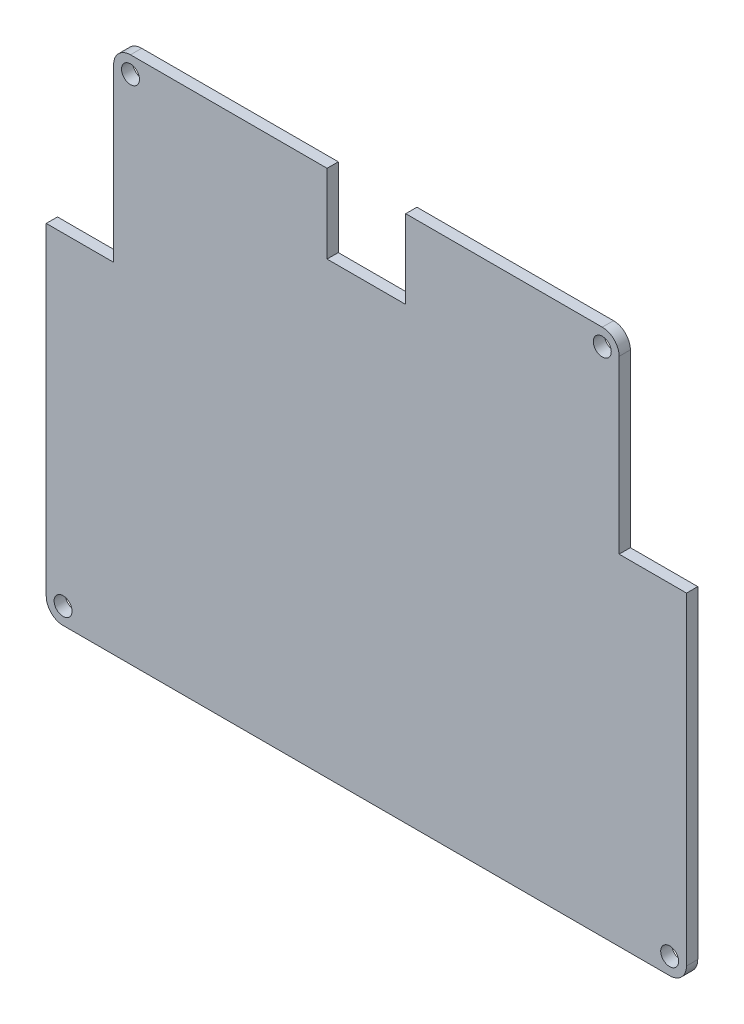
ISO-10303-21;
HEADER;
FILE_DESCRIPTION(('STEP AP214'),'2;1');
FILE_NAME('part.step','',(''),(''),'','','');
FILE_SCHEMA(('AUTOMOTIVE_DESIGN { 1 0 10303 214 1 1 1 1 }'));
ENDSEC;
DATA;
#1=APPLICATION_CONTEXT('core data for automotive mechanical design processes');
#2=APPLICATION_PROTOCOL_DEFINITION('international standard','automotive_design',2000,#1);
#3=PRODUCT_CONTEXT('',#1,'mechanical');
#4=PRODUCT('Part','Part','',(#3));
#5=PRODUCT_RELATED_PRODUCT_CATEGORY('part','',(#4));
#6=PRODUCT_DEFINITION_FORMATION('','',#4);
#7=PRODUCT_DEFINITION_CONTEXT('part definition',#1,'design');
#8=PRODUCT_DEFINITION('design','',#6,#7);
#9=PRODUCT_DEFINITION_SHAPE('','',#8);
#10=(LENGTH_UNIT() NAMED_UNIT(*) SI_UNIT(.MILLI.,.METRE.));
#11=(NAMED_UNIT(*) PLANE_ANGLE_UNIT() SI_UNIT($,.RADIAN.));
#12=(NAMED_UNIT(*) SI_UNIT($,.STERADIAN.) SOLID_ANGLE_UNIT());
#13=UNCERTAINTY_MEASURE_WITH_UNIT(LENGTH_MEASURE(1.E-05),#10,'distance_accuracy_value','');
#14=(GEOMETRIC_REPRESENTATION_CONTEXT(3) GLOBAL_UNCERTAINTY_ASSIGNED_CONTEXT((#13)) GLOBAL_UNIT_ASSIGNED_CONTEXT((#10,
#11,#12)) REPRESENTATION_CONTEXT('',''));
#15=CARTESIAN_POINT('',(0.,0.,0.));
#16=DIRECTION('',(0.,0.,1.));
#17=DIRECTION('',(1.,0.,0.));
#18=AXIS2_PLACEMENT_3D('',#15,#16,#17);
#19=CARTESIAN_POINT('',(54.,-29.1851675627543,2.));
#20=DIRECTION('',(0.,0.,-1.));
#21=DIRECTION('',(-1.,0.,0.));
#22=AXIS2_PLACEMENT_3D('',#19,#20,#21);
#23=PLANE('',#22);
#24=DIRECTION('',(0.,1.,0.));
#25=VECTOR('',#24,1.);
#26=CARTESIAN_POINT('',(57.,28.3148324372457,2.));
#27=LINE('',#26,#25);
#28=CARTESIAN_POINT('',(57.,-29.1851675627543,2.));
#29=VERTEX_POINT('',#28);
#30=CARTESIAN_POINT('',(57.,28.3148324372457,2.));
#31=VERTEX_POINT('',#30);
#32=EDGE_CURVE('E236',#29,#31,#27,.T.);
#33=ORIENTED_EDGE('',*,*,#32,.T.);
#34=DIRECTION('',(-1.,0.,0.));
#35=VECTOR('',#34,1.);
#36=CARTESIAN_POINT('',(57.,28.3148324372457,2.));
#37=LINE('',#36,#35);
#38=CARTESIAN_POINT('',(45.,28.3148324372457,2.));
#39=VERTEX_POINT('',#38);
#40=EDGE_CURVE('E124',#31,#39,#37,.T.);
#41=ORIENTED_EDGE('',*,*,#40,.T.);
#42=DIRECTION('',(0.,1.,0.));
#43=VECTOR('',#42,1.);
#44=CARTESIAN_POINT('',(45.,28.3148324372457,2.));
#45=LINE('',#44,#43);
#46=CARTESIAN_POINT('',(45.,58.8148324372457,2.));
#47=VERTEX_POINT('',#46);
#48=EDGE_CURVE('E289',#39,#47,#45,.T.);
#49=ORIENTED_EDGE('',*,*,#48,.T.);
#50=CARTESIAN_POINT('',(42.,58.8148324372457,2.));
#51=DIRECTION('',(0.,0.,1.));
#52=DIRECTION('',(1.,0.,0.));
#53=AXIS2_PLACEMENT_3D('',#50,#51,#52);
#54=CIRCLE('',#53,3.);
#55=CARTESIAN_POINT('',(42.,61.8148324372457,2.));
#56=VERTEX_POINT('',#55);
#57=EDGE_CURVE('E309',#47,#56,#54,.T.);
#58=ORIENTED_EDGE('',*,*,#57,.T.);
#59=DIRECTION('',(-1.,0.,0.));
#60=VECTOR('',#59,1.);
#61=CARTESIAN_POINT('',(7.,61.8148324372457,2.));
#62=LINE('',#61,#60);
#63=CARTESIAN_POINT('',(7.,61.8148324372457,2.));
#64=VERTEX_POINT('',#63);
#65=EDGE_CURVE('E305',#56,#64,#62,.T.);
#66=ORIENTED_EDGE('',*,*,#65,.T.);
#67=DIRECTION('',(0.,-1.,0.));
#68=VECTOR('',#67,1.);
#69=CARTESIAN_POINT('',(7.,61.8148324372457,2.));
#70=LINE('',#69,#68);
#71=CARTESIAN_POINT('',(7.,47.8148324372457,2.));
#72=VERTEX_POINT('',#71);
#73=EDGE_CURVE('E308',#64,#72,#70,.T.);
#74=ORIENTED_EDGE('',*,*,#73,.T.);
#75=DIRECTION('',(-1.,0.,0.));
#76=VECTOR('',#75,1.);
#77=CARTESIAN_POINT('',(-7.,47.8148324372457,2.));
#78=LINE('',#77,#76);
#79=CARTESIAN_POINT('',(-7.,47.8148324372457,2.));
#80=VERTEX_POINT('',#79);
#81=EDGE_CURVE('E313',#72,#80,#78,.T.);
#82=ORIENTED_EDGE('',*,*,#81,.T.);
#83=DIRECTION('',(0.,1.,0.));
#84=VECTOR('',#83,1.);
#85=CARTESIAN_POINT('',(-7.,61.8148324372457,2.));
#86=LINE('',#85,#84);
#87=CARTESIAN_POINT('',(-7.,61.8148324372457,2.));
#88=VERTEX_POINT('',#87);
#89=EDGE_CURVE('E320',#80,#88,#86,.T.);
#90=ORIENTED_EDGE('',*,*,#89,.T.);
#91=DIRECTION('',(-1.,0.,0.));
#92=VECTOR('',#91,1.);
#93=CARTESIAN_POINT('',(-42.,61.8148324372457,2.));
#94=LINE('',#93,#92);
#95=CARTESIAN_POINT('',(-42.,61.8148324372457,2.));
#96=VERTEX_POINT('',#95);
#97=EDGE_CURVE('E323',#88,#96,#94,.T.);
#98=ORIENTED_EDGE('',*,*,#97,.T.);
#99=CARTESIAN_POINT('',(-42.,58.8148324372457,2.));
#100=DIRECTION('',(0.,0.,1.));
#101=DIRECTION('',(-1.,0.,0.));
#102=AXIS2_PLACEMENT_3D('',#99,#100,#101);
#103=CIRCLE('',#102,3.);
#104=CARTESIAN_POINT('',(-45.,58.8148324372457,2.));
#105=VERTEX_POINT('',#104);
#106=EDGE_CURVE('E326',#96,#105,#103,.T.);
#107=ORIENTED_EDGE('',*,*,#106,.T.);
#108=DIRECTION('',(0.,-1.,0.));
#109=VECTOR('',#108,1.);
#110=CARTESIAN_POINT('',(-45.,28.3148324372457,2.));
#111=LINE('',#110,#109);
#112=CARTESIAN_POINT('',(-45.,28.3148324372457,2.));
#113=VERTEX_POINT('',#112);
#114=EDGE_CURVE('E329',#105,#113,#111,.T.);
#115=ORIENTED_EDGE('',*,*,#114,.T.);
#116=DIRECTION('',(-1.,0.,0.));
#117=VECTOR('',#116,1.);
#118=CARTESIAN_POINT('',(-45.,28.3148324372457,2.));
#119=LINE('',#118,#117);
#120=CARTESIAN_POINT('',(-57.,28.3148324372457,2.));
#121=VERTEX_POINT('',#120);
#122=EDGE_CURVE('E332',#113,#121,#119,.T.);
#123=ORIENTED_EDGE('',*,*,#122,.T.);
#124=DIRECTION('',(0.,-1.,0.));
#125=VECTOR('',#124,1.);
#126=CARTESIAN_POINT('',(-57.,28.3148324372457,2.));
#127=LINE('',#126,#125);
#128=CARTESIAN_POINT('',(-57.,-29.1851675627543,2.));
#129=VERTEX_POINT('',#128);
#130=EDGE_CURVE('E167',#121,#129,#127,.T.);
#131=ORIENTED_EDGE('',*,*,#130,.T.);
#132=CARTESIAN_POINT('',(-54.,-29.1851675627543,2.));
#133=DIRECTION('',(0.,0.,1.));
#134=DIRECTION('',(1.,0.,0.));
#135=AXIS2_PLACEMENT_3D('',#132,#133,#134);
#136=CIRCLE('',#135,3.);
#137=CARTESIAN_POINT('',(-54.,-32.1851675627543,2.));
#138=VERTEX_POINT('',#137);
#139=EDGE_CURVE('E161',#129,#138,#136,.T.);
#140=ORIENTED_EDGE('',*,*,#139,.T.);
#141=DIRECTION('',(1.,0.,0.));
#142=VECTOR('',#141,1.);
#143=CARTESIAN_POINT('',(54.,-32.1851675627543,2.));
#144=LINE('',#143,#142);
#145=CARTESIAN_POINT('',(54.,-32.1851675627543,2.));
#146=VERTEX_POINT('',#145);
#147=EDGE_CURVE('E165',#138,#146,#144,.T.);
#148=ORIENTED_EDGE('',*,*,#147,.T.);
#149=CARTESIAN_POINT('',(54.,-29.1851675627543,2.));
#150=DIRECTION('',(0.,0.,1.));
#151=DIRECTION('',(-1.,0.,0.));
#152=AXIS2_PLACEMENT_3D('',#149,#150,#151);
#153=CIRCLE('',#152,3.);
#154=EDGE_CURVE('E57',#146,#29,#153,.T.);
#155=ORIENTED_EDGE('',*,*,#154,.T.);
#156=EDGE_LOOP('',(#33,#41,#49,#58,#66,#74,#82,#90,#98,#107,#115,#123,#131,#140,#148,#155));
#157=FACE_BOUND('',#156,.T.);
#158=CARTESIAN_POINT('',(42.,58.8148324372457,2.));
#159=DIRECTION('',(0.,0.,1.));
#160=DIRECTION('',(1.,0.,0.));
#161=AXIS2_PLACEMENT_3D('',#158,#159,#160);
#162=CIRCLE('',#161,1.6);
#163=CARTESIAN_POINT('',(43.6,58.8148324372457,2.));
#164=VERTEX_POINT('',#163);
#165=EDGE_CURVE('E194',#164,#164,#162,.T.);
#166=ORIENTED_EDGE('',*,*,#165,.F.);
#167=EDGE_LOOP('',(#166));
#168=FACE_BOUND('',#167,.T.);
#169=CARTESIAN_POINT('',(54.,-29.1851675627543,2.));
#170=DIRECTION('',(0.,0.,1.));
#171=DIRECTION('',(1.,0.,0.));
#172=AXIS2_PLACEMENT_3D('',#169,#170,#171);
#173=CIRCLE('',#172,1.6);
#174=CARTESIAN_POINT('',(55.6,-29.1851675627543,2.));
#175=VERTEX_POINT('',#174);
#176=EDGE_CURVE('E402',#175,#175,#173,.T.);
#177=ORIENTED_EDGE('',*,*,#176,.F.);
#178=EDGE_LOOP('',(#177));
#179=FACE_BOUND('',#178,.T.);
#180=CARTESIAN_POINT('',(-54.,-29.1851675627543,2.));
#181=DIRECTION('',(0.,0.,1.));
#182=DIRECTION('',(-1.,0.,0.));
#183=AXIS2_PLACEMENT_3D('',#180,#181,#182);
#184=CIRCLE('',#183,1.6);
#185=CARTESIAN_POINT('',(-55.6,-29.1851675627543,2.));
#186=VERTEX_POINT('',#185);
#187=EDGE_CURVE('E394',#186,#186,#184,.T.);
#188=ORIENTED_EDGE('',*,*,#187,.F.);
#189=EDGE_LOOP('',(#188));
#190=FACE_BOUND('',#189,.T.);
#191=CARTESIAN_POINT('',(-42.,58.8148324372457,2.));
#192=DIRECTION('',(0.,0.,1.));
#193=DIRECTION('',(-1.,0.,0.));
#194=AXIS2_PLACEMENT_3D('',#191,#192,#193);
#195=CIRCLE('',#194,1.6);
#196=CARTESIAN_POINT('',(-43.6,58.8148324372457,2.));
#197=VERTEX_POINT('',#196);
#198=EDGE_CURVE('E383',#197,#197,#195,.T.);
#199=ORIENTED_EDGE('',*,*,#198,.F.);
#200=EDGE_LOOP('',(#199));
#201=FACE_BOUND('',#200,.T.);
#202=ADVANCED_FACE('F39',(#157,#168,#179,#190,#201),#23,.F.);
#203=CARTESIAN_POINT('',(54.,-29.1851675627543,0.));
#204=DIRECTION('',(0.,0.,-1.));
#205=DIRECTION('',(-1.,0.,0.));
#206=AXIS2_PLACEMENT_3D('',#203,#204,#205);
#207=PLANE('',#206);
#208=CARTESIAN_POINT('',(-54.,-29.1851675627543,0.));
#209=DIRECTION('',(0.,0.,1.));
#210=DIRECTION('',(-1.,0.,0.));
#211=AXIS2_PLACEMENT_3D('',#208,#209,#210);
#212=CIRCLE('',#211,1.6);
#213=CARTESIAN_POINT('',(-55.6,-29.1851675627543,0.));
#214=VERTEX_POINT('',#213);
#215=EDGE_CURVE('E391',#214,#214,#212,.T.);
#216=ORIENTED_EDGE('',*,*,#215,.T.);
#217=EDGE_LOOP('',(#216));
#218=FACE_BOUND('',#217,.T.);
#219=CARTESIAN_POINT('',(42.,58.8148324372457,0.));
#220=DIRECTION('',(0.,0.,1.));
#221=DIRECTION('',(1.,0.,0.));
#222=AXIS2_PLACEMENT_3D('',#219,#220,#221);
#223=CIRCLE('',#222,1.6);
#224=CARTESIAN_POINT('',(43.6,58.8148324372457,0.));
#225=VERTEX_POINT('',#224);
#226=EDGE_CURVE('E406',#225,#225,#223,.T.);
#227=ORIENTED_EDGE('',*,*,#226,.T.);
#228=EDGE_LOOP('',(#227));
#229=FACE_BOUND('',#228,.T.);
#230=DIRECTION('',(0.,1.,0.));
#231=VECTOR('',#230,1.);
#232=CARTESIAN_POINT('',(57.,28.3148324372457,0.));
#233=LINE('',#232,#231);
#234=CARTESIAN_POINT('',(57.,-29.1851675627543,0.));
#235=VERTEX_POINT('',#234);
#236=CARTESIAN_POINT('',(57.,28.3148324372457,0.));
#237=VERTEX_POINT('',#236);
#238=EDGE_CURVE('E189',#235,#237,#233,.T.);
#239=ORIENTED_EDGE('',*,*,#238,.F.);
#240=CARTESIAN_POINT('',(54.,-29.1851675627543,0.));
#241=DIRECTION('',(0.,0.,1.));
#242=DIRECTION('',(-1.,0.,0.));
#243=AXIS2_PLACEMENT_3D('',#240,#241,#242);
#244=CIRCLE('',#243,3.);
#245=CARTESIAN_POINT('',(54.,-32.1851675627543,0.));
#246=VERTEX_POINT('',#245);
#247=EDGE_CURVE('E116',#246,#235,#244,.T.);
#248=ORIENTED_EDGE('',*,*,#247,.F.);
#249=DIRECTION('',(1.,0.,0.));
#250=VECTOR('',#249,1.);
#251=CARTESIAN_POINT('',(54.,-32.1851675627543,0.));
#252=LINE('',#251,#250);
#253=CARTESIAN_POINT('',(-54.,-32.1851675627543,0.));
#254=VERTEX_POINT('',#253);
#255=EDGE_CURVE('E110',#254,#246,#252,.T.);
#256=ORIENTED_EDGE('',*,*,#255,.F.);
#257=CARTESIAN_POINT('',(-54.,-29.1851675627543,0.));
#258=DIRECTION('',(0.,0.,1.));
#259=DIRECTION('',(1.,0.,0.));
#260=AXIS2_PLACEMENT_3D('',#257,#258,#259);
#261=CIRCLE('',#260,3.);
#262=CARTESIAN_POINT('',(-57.,-29.1851675627543,0.));
#263=VERTEX_POINT('',#262);
#264=EDGE_CURVE('E176',#263,#254,#261,.T.);
#265=ORIENTED_EDGE('',*,*,#264,.F.);
#266=DIRECTION('',(0.,-1.,0.));
#267=VECTOR('',#266,1.);
#268=CARTESIAN_POINT('',(-57.,28.3148324372457,0.));
#269=LINE('',#268,#267);
#270=CARTESIAN_POINT('',(-57.,28.3148324372457,0.));
#271=VERTEX_POINT('',#270);
#272=EDGE_CURVE('E227',#271,#263,#269,.T.);
#273=ORIENTED_EDGE('',*,*,#272,.F.);
#274=DIRECTION('',(-1.,0.,0.));
#275=VECTOR('',#274,1.);
#276=CARTESIAN_POINT('',(-45.,28.3148324372457,0.));
#277=LINE('',#276,#275);
#278=CARTESIAN_POINT('',(-45.,28.3148324372457,0.));
#279=VERTEX_POINT('',#278);
#280=EDGE_CURVE('E224',#279,#271,#277,.T.);
#281=ORIENTED_EDGE('',*,*,#280,.F.);
#282=DIRECTION('',(0.,-1.,0.));
#283=VECTOR('',#282,1.);
#284=CARTESIAN_POINT('',(-45.,28.3148324372457,0.));
#285=LINE('',#284,#283);
#286=CARTESIAN_POINT('',(-45.,58.8148324372457,0.));
#287=VERTEX_POINT('',#286);
#288=EDGE_CURVE('E221',#287,#279,#285,.T.);
#289=ORIENTED_EDGE('',*,*,#288,.F.);
#290=CARTESIAN_POINT('',(-42.,58.8148324372457,0.));
#291=DIRECTION('',(0.,0.,1.));
#292=DIRECTION('',(-1.,0.,0.));
#293=AXIS2_PLACEMENT_3D('',#290,#291,#292);
#294=CIRCLE('',#293,3.);
#295=CARTESIAN_POINT('',(-42.,61.8148324372457,0.));
#296=VERTEX_POINT('',#295);
#297=EDGE_CURVE('E218',#296,#287,#294,.T.);
#298=ORIENTED_EDGE('',*,*,#297,.F.);
#299=DIRECTION('',(-1.,0.,0.));
#300=VECTOR('',#299,1.);
#301=CARTESIAN_POINT('',(-42.,61.8148324372457,0.));
#302=LINE('',#301,#300);
#303=CARTESIAN_POINT('',(-7.,61.8148324372457,0.));
#304=VERTEX_POINT('',#303);
#305=EDGE_CURVE('E215',#304,#296,#302,.T.);
#306=ORIENTED_EDGE('',*,*,#305,.F.);
#307=DIRECTION('',(0.,1.,0.));
#308=VECTOR('',#307,1.);
#309=CARTESIAN_POINT('',(-7.,61.8148324372457,0.));
#310=LINE('',#309,#308);
#311=CARTESIAN_POINT('',(-7.,47.8148324372457,0.));
#312=VERTEX_POINT('',#311);
#313=EDGE_CURVE('E212',#312,#304,#310,.T.);
#314=ORIENTED_EDGE('',*,*,#313,.F.);
#315=DIRECTION('',(-1.,0.,0.));
#316=VECTOR('',#315,1.);
#317=CARTESIAN_POINT('',(-7.,47.8148324372457,0.));
#318=LINE('',#317,#316);
#319=CARTESIAN_POINT('',(7.,47.8148324372457,0.));
#320=VERTEX_POINT('',#319);
#321=EDGE_CURVE('E209',#320,#312,#318,.T.);
#322=ORIENTED_EDGE('',*,*,#321,.F.);
#323=DIRECTION('',(0.,-1.,0.));
#324=VECTOR('',#323,1.);
#325=CARTESIAN_POINT('',(7.,61.8148324372457,0.));
#326=LINE('',#325,#324);
#327=CARTESIAN_POINT('',(7.,61.8148324372457,0.));
#328=VERTEX_POINT('',#327);
#329=EDGE_CURVE('E206',#328,#320,#326,.T.);
#330=ORIENTED_EDGE('',*,*,#329,.F.);
#331=DIRECTION('',(-1.,0.,0.));
#332=VECTOR('',#331,1.);
#333=CARTESIAN_POINT('',(7.,61.8148324372457,0.));
#334=LINE('',#333,#332);
#335=CARTESIAN_POINT('',(42.,61.8148324372457,0.));
#336=VERTEX_POINT('',#335);
#337=EDGE_CURVE('E203',#336,#328,#334,.T.);
#338=ORIENTED_EDGE('',*,*,#337,.F.);
#339=CARTESIAN_POINT('',(42.,58.8148324372457,0.));
#340=DIRECTION('',(0.,0.,1.));
#341=DIRECTION('',(1.,0.,0.));
#342=AXIS2_PLACEMENT_3D('',#339,#340,#341);
#343=CIRCLE('',#342,3.);
#344=CARTESIAN_POINT('',(45.,58.8148324372457,0.));
#345=VERTEX_POINT('',#344);
#346=EDGE_CURVE('E200',#345,#336,#343,.T.);
#347=ORIENTED_EDGE('',*,*,#346,.F.);
#348=DIRECTION('',(0.,1.,0.));
#349=VECTOR('',#348,1.);
#350=CARTESIAN_POINT('',(45.,28.3148324372457,0.));
#351=LINE('',#350,#349);
#352=CARTESIAN_POINT('',(45.,28.3148324372457,0.));
#353=VERTEX_POINT('',#352);
#354=EDGE_CURVE('E197',#353,#345,#351,.T.);
#355=ORIENTED_EDGE('',*,*,#354,.F.);
#356=DIRECTION('',(-1.,0.,0.));
#357=VECTOR('',#356,1.);
#358=CARTESIAN_POINT('',(57.,28.3148324372457,0.));
#359=LINE('',#358,#357);
#360=EDGE_CURVE('E193',#237,#353,#359,.T.);
#361=ORIENTED_EDGE('',*,*,#360,.F.);
#362=EDGE_LOOP('',(#239,#248,#256,#265,#273,#281,#289,#298,#306,#314,#322,#330,#338,#347,#355,#361));
#363=FACE_BOUND('',#362,.T.);
#364=CARTESIAN_POINT('',(54.,-29.1851675627543,0.));
#365=DIRECTION('',(0.,0.,1.));
#366=DIRECTION('',(1.,0.,0.));
#367=AXIS2_PLACEMENT_3D('',#364,#365,#366);
#368=CIRCLE('',#367,1.6);
#369=CARTESIAN_POINT('',(55.6,-29.1851675627543,0.));
#370=VERTEX_POINT('',#369);
#371=EDGE_CURVE('E398',#370,#370,#368,.T.);
#372=ORIENTED_EDGE('',*,*,#371,.T.);
#373=EDGE_LOOP('',(#372));
#374=FACE_BOUND('',#373,.T.);
#375=CARTESIAN_POINT('',(-42.,58.8148324372457,0.));
#376=DIRECTION('',(0.,0.,1.));
#377=DIRECTION('',(-1.,0.,0.));
#378=AXIS2_PLACEMENT_3D('',#375,#376,#377);
#379=CIRCLE('',#378,1.6);
#380=CARTESIAN_POINT('',(-43.6,58.8148324372457,0.));
#381=VERTEX_POINT('',#380);
#382=EDGE_CURVE('E386',#381,#381,#379,.T.);
#383=ORIENTED_EDGE('',*,*,#382,.T.);
#384=EDGE_LOOP('',(#383));
#385=FACE_BOUND('',#384,.T.);
#386=ADVANCED_FACE('F293',(#218,#229,#363,#374,#385),#207,.T.);
#387=CARTESIAN_POINT('',(57.,28.3148324372457,2.));
#388=DIRECTION('',(-1.,0.,0.));
#389=DIRECTION('',(0.,0.,1.));
#390=AXIS2_PLACEMENT_3D('',#387,#388,#389);
#391=PLANE('',#390);
#392=ORIENTED_EDGE('',*,*,#238,.T.);
#393=DIRECTION('',(0.,0.,-1.));
#394=VECTOR('',#393,1.);
#395=CARTESIAN_POINT('',(57.,28.3148324372457,2.));
#396=LINE('',#395,#394);
#397=EDGE_CURVE('E11',#31,#237,#396,.T.);
#398=ORIENTED_EDGE('',*,*,#397,.F.);
#399=ORIENTED_EDGE('',*,*,#32,.F.);
#400=DIRECTION('',(0.,0.,-1.));
#401=VECTOR('',#400,1.);
#402=CARTESIAN_POINT('',(57.,-29.1851675627543,2.));
#403=LINE('',#402,#401);
#404=EDGE_CURVE('E185',#29,#235,#403,.T.);
#405=ORIENTED_EDGE('',*,*,#404,.T.);
#406=EDGE_LOOP('',(#392,#398,#399,#405));
#407=FACE_BOUND('',#406,.T.);
#408=ADVANCED_FACE('F41',(#407),#391,.F.);
#409=CARTESIAN_POINT('',(57.,28.3148324372457,2.));
#410=DIRECTION('',(0.,-1.,0.));
#411=DIRECTION('',(0.,0.,-1.));
#412=AXIS2_PLACEMENT_3D('',#409,#410,#411);
#413=PLANE('',#412);
#414=ORIENTED_EDGE('',*,*,#360,.T.);
#415=DIRECTION('',(0.,0.,-1.));
#416=VECTOR('',#415,1.);
#417=CARTESIAN_POINT('',(45.,28.3148324372457,2.));
#418=LINE('',#417,#416);
#419=EDGE_CURVE('E49',#39,#353,#418,.T.);
#420=ORIENTED_EDGE('',*,*,#419,.F.);
#421=ORIENTED_EDGE('',*,*,#40,.F.);
#422=ORIENTED_EDGE('',*,*,#397,.T.);
#423=EDGE_LOOP('',(#414,#420,#421,#422));
#424=FACE_BOUND('',#423,.T.);
#425=ADVANCED_FACE('F564',(#424),#413,.F.);
#426=CARTESIAN_POINT('',(45.,28.3148324372457,2.));
#427=DIRECTION('',(-1.,0.,0.));
#428=DIRECTION('',(0.,0.,1.));
#429=AXIS2_PLACEMENT_3D('',#426,#427,#428);
#430=PLANE('',#429);
#431=ORIENTED_EDGE('',*,*,#354,.T.);
#432=DIRECTION('',(0.,0.,-1.));
#433=VECTOR('',#432,1.);
#434=CARTESIAN_POINT('',(45.,58.8148324372457,2.));
#435=LINE('',#434,#433);
#436=EDGE_CURVE('E279',#47,#345,#435,.T.);
#437=ORIENTED_EDGE('',*,*,#436,.F.);
#438=ORIENTED_EDGE('',*,*,#48,.F.);
#439=ORIENTED_EDGE('',*,*,#419,.T.);
#440=EDGE_LOOP('',(#431,#437,#438,#439));
#441=FACE_BOUND('',#440,.T.);
#442=ADVANCED_FACE('F287',(#441),#430,.F.);
#443=CARTESIAN_POINT('',(42.,58.8148324372457,2.));
#444=DIRECTION('',(0.,0.,-1.));
#445=DIRECTION('',(-1.,0.,0.));
#446=AXIS2_PLACEMENT_3D('',#443,#444,#445);
#447=CYLINDRICAL_SURFACE('',#446,3.);
#448=ORIENTED_EDGE('',*,*,#346,.T.);
#449=DIRECTION('',(0.,0.,-1.));
#450=VECTOR('',#449,1.);
#451=CARTESIAN_POINT('',(42.,61.8148324372457,2.));
#452=LINE('',#451,#450);
#453=EDGE_CURVE('E275',#56,#336,#452,.T.);
#454=ORIENTED_EDGE('',*,*,#453,.F.);
#455=ORIENTED_EDGE('',*,*,#57,.F.);
#456=ORIENTED_EDGE('',*,*,#436,.T.);
#457=EDGE_LOOP('',(#448,#454,#455,#456));
#458=FACE_BOUND('',#457,.T.);
#459=ADVANCED_FACE('F299',(#458),#447,.T.);
#460=CARTESIAN_POINT('',(7.,61.8148324372457,2.));
#461=DIRECTION('',(0.,-1.,0.));
#462=DIRECTION('',(1.,0.,0.));
#463=AXIS2_PLACEMENT_3D('',#460,#461,#462);
#464=PLANE('',#463);
#465=ORIENTED_EDGE('',*,*,#337,.T.);
#466=DIRECTION('',(0.,0.,-1.));
#467=VECTOR('',#466,1.);
#468=CARTESIAN_POINT('',(7.,61.8148324372457,2.));
#469=LINE('',#468,#467);
#470=EDGE_CURVE('E271',#64,#328,#469,.T.);
#471=ORIENTED_EDGE('',*,*,#470,.F.);
#472=ORIENTED_EDGE('',*,*,#65,.F.);
#473=ORIENTED_EDGE('',*,*,#453,.T.);
#474=EDGE_LOOP('',(#465,#471,#472,#473));
#475=FACE_BOUND('',#474,.T.);
#476=ADVANCED_FACE('F303',(#475),#464,.F.);
#477=CARTESIAN_POINT('',(7.,61.8148324372457,2.));
#478=DIRECTION('',(1.,0.,0.));
#479=DIRECTION('',(0.,0.,-1.));
#480=AXIS2_PLACEMENT_3D('',#477,#478,#479);
#481=PLANE('',#480);
#482=ORIENTED_EDGE('',*,*,#329,.T.);
#483=DIRECTION('',(0.,0.,-1.));
#484=VECTOR('',#483,1.);
#485=CARTESIAN_POINT('',(7.,47.8148324372457,2.));
#486=LINE('',#485,#484);
#487=EDGE_CURVE('E267',#72,#320,#486,.T.);
#488=ORIENTED_EDGE('',*,*,#487,.F.);
#489=ORIENTED_EDGE('',*,*,#73,.F.);
#490=ORIENTED_EDGE('',*,*,#470,.T.);
#491=EDGE_LOOP('',(#482,#488,#489,#490));
#492=FACE_BOUND('',#491,.T.);
#493=ADVANCED_FACE('F529',(#492),#481,.F.);
#494=CARTESIAN_POINT('',(-7.,47.8148324372457,2.));
#495=DIRECTION('',(0.,-1.,0.));
#496=DIRECTION('',(0.,0.,-1.));
#497=AXIS2_PLACEMENT_3D('',#494,#495,#496);
#498=PLANE('',#497);
#499=ORIENTED_EDGE('',*,*,#321,.T.);
#500=DIRECTION('',(0.,0.,-1.));
#501=VECTOR('',#500,1.);
#502=CARTESIAN_POINT('',(-7.,47.8148324372457,2.));
#503=LINE('',#502,#501);
#504=EDGE_CURVE('E263',#80,#312,#503,.T.);
#505=ORIENTED_EDGE('',*,*,#504,.F.);
#506=ORIENTED_EDGE('',*,*,#81,.F.);
#507=ORIENTED_EDGE('',*,*,#487,.T.);
#508=EDGE_LOOP('',(#499,#505,#506,#507));
#509=FACE_BOUND('',#508,.T.);
#510=ADVANCED_FACE('F519',(#509),#498,.F.);
#511=CARTESIAN_POINT('',(-7.,61.8148324372457,2.));
#512=DIRECTION('',(-1.,0.,0.));
#513=DIRECTION('',(0.,-1.,0.));
#514=AXIS2_PLACEMENT_3D('',#511,#512,#513);
#515=PLANE('',#514);
#516=ORIENTED_EDGE('',*,*,#313,.T.);
#517=DIRECTION('',(0.,0.,-1.));
#518=VECTOR('',#517,1.);
#519=CARTESIAN_POINT('',(-7.,61.8148324372457,2.));
#520=LINE('',#519,#518);
#521=EDGE_CURVE('E259',#88,#304,#520,.T.);
#522=ORIENTED_EDGE('',*,*,#521,.F.);
#523=ORIENTED_EDGE('',*,*,#89,.F.);
#524=ORIENTED_EDGE('',*,*,#504,.T.);
#525=EDGE_LOOP('',(#516,#522,#523,#524));
#526=FACE_BOUND('',#525,.T.);
#527=ADVANCED_FACE('F509',(#526),#515,.F.);
#528=CARTESIAN_POINT('',(-42.,61.8148324372457,2.));
#529=DIRECTION('',(0.,-1.,0.));
#530=DIRECTION('',(0.,0.,-1.));
#531=AXIS2_PLACEMENT_3D('',#528,#529,#530);
#532=PLANE('',#531);
#533=ORIENTED_EDGE('',*,*,#305,.T.);
#534=DIRECTION('',(0.,0.,-1.));
#535=VECTOR('',#534,1.);
#536=CARTESIAN_POINT('',(-42.,61.8148324372457,2.));
#537=LINE('',#536,#535);
#538=EDGE_CURVE('E255',#96,#296,#537,.T.);
#539=ORIENTED_EDGE('',*,*,#538,.F.);
#540=ORIENTED_EDGE('',*,*,#97,.F.);
#541=ORIENTED_EDGE('',*,*,#521,.T.);
#542=EDGE_LOOP('',(#533,#539,#540,#541));
#543=FACE_BOUND('',#542,.T.);
#544=ADVANCED_FACE('F499',(#543),#532,.F.);
#545=CARTESIAN_POINT('',(-42.,58.8148324372457,2.));
#546=DIRECTION('',(0.,0.,-1.));
#547=DIRECTION('',(-1.,0.,0.));
#548=AXIS2_PLACEMENT_3D('',#545,#546,#547);
#549=CYLINDRICAL_SURFACE('',#548,3.);
#550=ORIENTED_EDGE('',*,*,#297,.T.);
#551=DIRECTION('',(0.,0.,-1.));
#552=VECTOR('',#551,1.);
#553=CARTESIAN_POINT('',(-45.,58.8148324372457,2.));
#554=LINE('',#553,#552);
#555=EDGE_CURVE('E251',#105,#287,#554,.T.);
#556=ORIENTED_EDGE('',*,*,#555,.F.);
#557=ORIENTED_EDGE('',*,*,#106,.F.);
#558=ORIENTED_EDGE('',*,*,#538,.T.);
#559=EDGE_LOOP('',(#550,#556,#557,#558));
#560=FACE_BOUND('',#559,.T.);
#561=ADVANCED_FACE('F489',(#560),#549,.T.);
#562=CARTESIAN_POINT('',(-45.,28.3148324372457,2.));
#563=DIRECTION('',(1.,0.,0.));
#564=DIRECTION('',(0.,0.,-1.));
#565=AXIS2_PLACEMENT_3D('',#562,#563,#564);
#566=PLANE('',#565);
#567=ORIENTED_EDGE('',*,*,#288,.T.);
#568=DIRECTION('',(0.,0.,-1.));
#569=VECTOR('',#568,1.);
#570=CARTESIAN_POINT('',(-45.,28.3148324372457,2.));
#571=LINE('',#570,#569);
#572=EDGE_CURVE('E247',#113,#279,#571,.T.);
#573=ORIENTED_EDGE('',*,*,#572,.F.);
#574=ORIENTED_EDGE('',*,*,#114,.F.);
#575=ORIENTED_EDGE('',*,*,#555,.T.);
#576=EDGE_LOOP('',(#567,#573,#574,#575));
#577=FACE_BOUND('',#576,.T.);
#578=ADVANCED_FACE('F480',(#577),#566,.F.);
#579=CARTESIAN_POINT('',(-45.,28.3148324372457,2.));
#580=DIRECTION('',(0.,-1.,0.));
#581=DIRECTION('',(0.,0.,-1.));
#582=AXIS2_PLACEMENT_3D('',#579,#580,#581);
#583=PLANE('',#582);
#584=ORIENTED_EDGE('',*,*,#280,.T.);
#585=DIRECTION('',(0.,0.,-1.));
#586=VECTOR('',#585,1.);
#587=CARTESIAN_POINT('',(-57.,28.3148324372457,2.));
#588=LINE('',#587,#586);
#589=EDGE_CURVE('E243',#121,#271,#588,.T.);
#590=ORIENTED_EDGE('',*,*,#589,.F.);
#591=ORIENTED_EDGE('',*,*,#122,.F.);
#592=ORIENTED_EDGE('',*,*,#572,.T.);
#593=EDGE_LOOP('',(#584,#590,#591,#592));
#594=FACE_BOUND('',#593,.T.);
#595=ADVANCED_FACE('F340',(#594),#583,.F.);
#596=CARTESIAN_POINT('',(-57.,28.3148324372457,2.));
#597=DIRECTION('',(1.,0.,0.));
#598=DIRECTION('',(0.,0.,-1.));
#599=AXIS2_PLACEMENT_3D('',#596,#597,#598);
#600=PLANE('',#599);
#601=ORIENTED_EDGE('',*,*,#272,.T.);
#602=DIRECTION('',(0.,0.,-1.));
#603=VECTOR('',#602,1.);
#604=CARTESIAN_POINT('',(-57.,-29.1851675627543,2.));
#605=LINE('',#604,#603);
#606=EDGE_CURVE('E178',#129,#263,#605,.T.);
#607=ORIENTED_EDGE('',*,*,#606,.F.);
#608=ORIENTED_EDGE('',*,*,#130,.F.);
#609=ORIENTED_EDGE('',*,*,#589,.T.);
#610=EDGE_LOOP('',(#601,#607,#608,#609));
#611=FACE_BOUND('',#610,.T.);
#612=ADVANCED_FACE('F344',(#611),#600,.F.);
#613=CARTESIAN_POINT('',(-54.,-29.1851675627543,2.));
#614=DIRECTION('',(0.,0.,-1.));
#615=DIRECTION('',(-1.,0.,0.));
#616=AXIS2_PLACEMENT_3D('',#613,#614,#615);
#617=CYLINDRICAL_SURFACE('',#616,3.);
#618=ORIENTED_EDGE('',*,*,#264,.T.);
#619=DIRECTION('',(0.,0.,-1.));
#620=VECTOR('',#619,1.);
#621=CARTESIAN_POINT('',(-54.,-32.1851675627543,2.));
#622=LINE('',#621,#620);
#623=EDGE_CURVE('E173',#138,#254,#622,.T.);
#624=ORIENTED_EDGE('',*,*,#623,.F.);
#625=ORIENTED_EDGE('',*,*,#139,.F.);
#626=ORIENTED_EDGE('',*,*,#606,.T.);
#627=EDGE_LOOP('',(#618,#624,#625,#626));
#628=FACE_BOUND('',#627,.T.);
#629=ADVANCED_FACE('F174',(#628),#617,.T.);
#630=CARTESIAN_POINT('',(54.,-32.1851675627543,2.));
#631=DIRECTION('',(0.,1.,0.));
#632=DIRECTION('',(-1.,0.,0.));
#633=AXIS2_PLACEMENT_3D('',#630,#631,#632);
#634=PLANE('',#633);
#635=ORIENTED_EDGE('',*,*,#255,.T.);
#636=DIRECTION('',(0.,0.,-1.));
#637=VECTOR('',#636,1.);
#638=CARTESIAN_POINT('',(54.,-32.1851675627543,2.));
#639=LINE('',#638,#637);
#640=EDGE_CURVE('E179',#146,#246,#639,.T.);
#641=ORIENTED_EDGE('',*,*,#640,.F.);
#642=ORIENTED_EDGE('',*,*,#147,.F.);
#643=ORIENTED_EDGE('',*,*,#623,.T.);
#644=EDGE_LOOP('',(#635,#641,#642,#643));
#645=FACE_BOUND('',#644,.T.);
#646=ADVANCED_FACE('F181',(#645),#634,.F.);
#647=CARTESIAN_POINT('',(54.,-29.1851675627543,2.));
#648=DIRECTION('',(0.,0.,-1.));
#649=DIRECTION('',(-1.,0.,0.));
#650=AXIS2_PLACEMENT_3D('',#647,#648,#649);
#651=CYLINDRICAL_SURFACE('',#650,3.);
#652=ORIENTED_EDGE('',*,*,#247,.T.);
#653=ORIENTED_EDGE('',*,*,#404,.F.);
#654=ORIENTED_EDGE('',*,*,#154,.F.);
#655=ORIENTED_EDGE('',*,*,#640,.T.);
#656=EDGE_LOOP('',(#652,#653,#654,#655));
#657=FACE_BOUND('',#656,.T.);
#658=ADVANCED_FACE('F348',(#657),#651,.T.);
#659=CARTESIAN_POINT('',(42.,58.8148324372457,2.));
#660=DIRECTION('',(0.,0.,-1.));
#661=DIRECTION('',(-1.,0.,0.));
#662=AXIS2_PLACEMENT_3D('',#659,#660,#661);
#663=CYLINDRICAL_SURFACE('',#662,1.6);
#664=ORIENTED_EDGE('',*,*,#165,.T.);
#665=EDGE_LOOP('',(#664));
#666=FACE_BOUND('',#665,.T.);
#667=ORIENTED_EDGE('',*,*,#226,.F.);
#668=EDGE_LOOP('',(#667));
#669=FACE_BOUND('',#668,.T.);
#670=ADVANCED_FACE('F350',(#666,#669),#663,.F.);
#671=CARTESIAN_POINT('',(54.,-29.1851675627543,2.));
#672=DIRECTION('',(0.,0.,-1.));
#673=DIRECTION('',(-1.,0.,0.));
#674=AXIS2_PLACEMENT_3D('',#671,#672,#673);
#675=CYLINDRICAL_SURFACE('',#674,1.6);
#676=ORIENTED_EDGE('',*,*,#176,.T.);
#677=EDGE_LOOP('',(#676));
#678=FACE_BOUND('',#677,.T.);
#679=ORIENTED_EDGE('',*,*,#371,.F.);
#680=EDGE_LOOP('',(#679));
#681=FACE_BOUND('',#680,.T.);
#682=ADVANCED_FACE('F356',(#678,#681),#675,.F.);
#683=CARTESIAN_POINT('',(-54.,-29.1851675627543,2.));
#684=DIRECTION('',(0.,0.,-1.));
#685=DIRECTION('',(-1.,0.,0.));
#686=AXIS2_PLACEMENT_3D('',#683,#684,#685);
#687=CYLINDRICAL_SURFACE('',#686,1.6);
#688=ORIENTED_EDGE('',*,*,#187,.T.);
#689=EDGE_LOOP('',(#688));
#690=FACE_BOUND('',#689,.T.);
#691=ORIENTED_EDGE('',*,*,#215,.F.);
#692=EDGE_LOOP('',(#691));
#693=FACE_BOUND('',#692,.T.);
#694=ADVANCED_FACE('F370',(#690,#693),#687,.F.);
#695=CARTESIAN_POINT('',(-42.,58.8148324372457,2.));
#696=DIRECTION('',(0.,0.,-1.));
#697=DIRECTION('',(-1.,0.,0.));
#698=AXIS2_PLACEMENT_3D('',#695,#696,#697);
#699=CYLINDRICAL_SURFACE('',#698,1.6);
#700=ORIENTED_EDGE('',*,*,#198,.T.);
#701=EDGE_LOOP('',(#700));
#702=FACE_BOUND('',#701,.T.);
#703=ORIENTED_EDGE('',*,*,#382,.F.);
#704=EDGE_LOOP('',(#703));
#705=FACE_BOUND('',#704,.T.);
#706=ADVANCED_FACE('F374',(#702,#705),#699,.F.);
#707=CLOSED_SHELL('',(#202,#386,#408,#425,#442,#459,#476,#493,#510,#527,#544,#561,#578,#595,
#612,#629,#646,#658,#670,#682,#694,#706));
#708=MANIFOLD_SOLID_BREP('B2',#707);
#709=ADVANCED_BREP_SHAPE_REPRESENTATION('',(#18,#708),#14);
#710=SHAPE_DEFINITION_REPRESENTATION(#9,#709);
ENDSEC;
END-ISO-10303-21;
